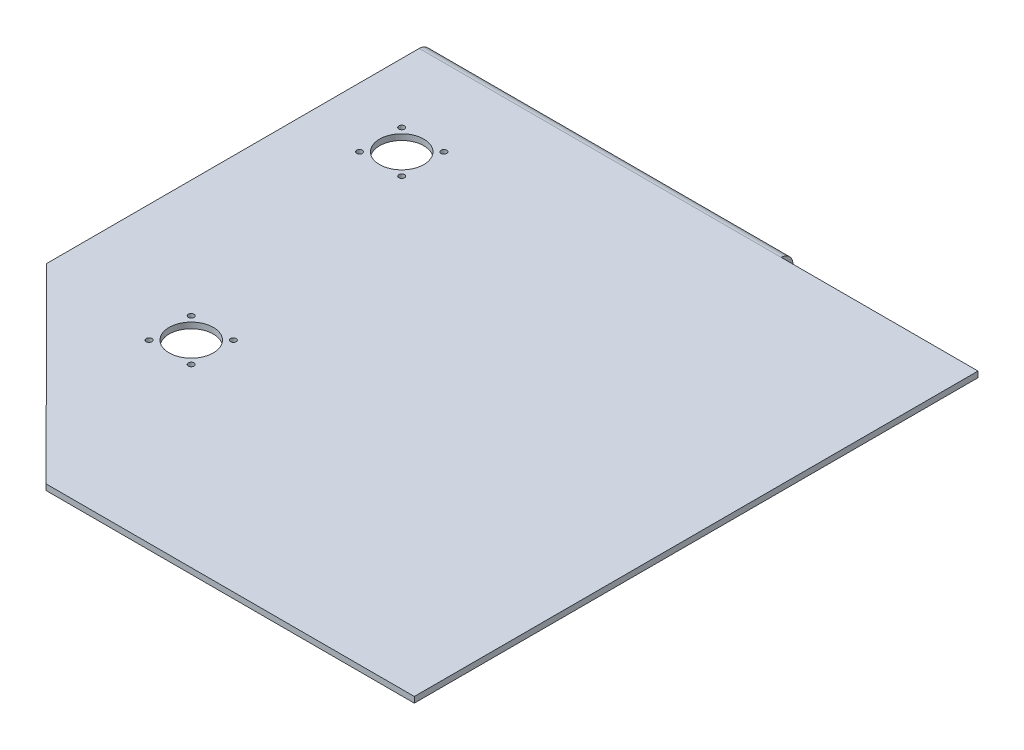
ISO-10303-21;
HEADER;
FILE_DESCRIPTION(('STEP AP214'),'2;1');
FILE_NAME('part.step','',(''),(''),'','','');
FILE_SCHEMA(('AUTOMOTIVE_DESIGN { 1 0 10303 214 1 1 1 1 }'));
ENDSEC;
DATA;
#1=APPLICATION_CONTEXT('core data for automotive mechanical design processes');
#2=APPLICATION_PROTOCOL_DEFINITION('international standard','automotive_design',2000,#1);
#3=PRODUCT_CONTEXT('',#1,'mechanical');
#4=PRODUCT('Part','Part','',(#3));
#5=PRODUCT_RELATED_PRODUCT_CATEGORY('part','',(#4));
#6=PRODUCT_DEFINITION_FORMATION('','',#4);
#7=PRODUCT_DEFINITION_CONTEXT('part definition',#1,'design');
#8=PRODUCT_DEFINITION('design','',#6,#7);
#9=PRODUCT_DEFINITION_SHAPE('','',#8);
#10=(LENGTH_UNIT() NAMED_UNIT(*) SI_UNIT(.MILLI.,.METRE.));
#11=(NAMED_UNIT(*) PLANE_ANGLE_UNIT() SI_UNIT($,.RADIAN.));
#12=(NAMED_UNIT(*) SI_UNIT($,.STERADIAN.) SOLID_ANGLE_UNIT());
#13=UNCERTAINTY_MEASURE_WITH_UNIT(LENGTH_MEASURE(1.E-05),#10,'distance_accuracy_value','');
#14=(GEOMETRIC_REPRESENTATION_CONTEXT(3) GLOBAL_UNCERTAINTY_ASSIGNED_CONTEXT((#13)) GLOBAL_UNIT_ASSIGNED_CONTEXT((#10,
#11,#12)) REPRESENTATION_CONTEXT('',''));
#15=CARTESIAN_POINT('',(0.,0.,0.));
#16=DIRECTION('',(0.,0.,1.));
#17=DIRECTION('',(1.,0.,0.));
#18=AXIS2_PLACEMENT_3D('',#15,#16,#17);
#19=CARTESIAN_POINT('',(50.8,-3.175,-290.95699999996));
#20=DIRECTION('',(0.,0.,-1.));
#21=DIRECTION('',(-1.,0.,0.));
#22=AXIS2_PLACEMENT_3D('',#19,#20,#21);
#23=PLANE('',#22);
#24=DIRECTION('',(-1.,0.,0.));
#25=VECTOR('',#24,1.);
#26=CARTESIAN_POINT('',(50.8,-3.175,-290.95699999996));
#27=LINE('',#26,#25);
#28=CARTESIAN_POINT('',(355.6,-3.175,-290.95699999996));
#29=VERTEX_POINT('',#28);
#30=CARTESIAN_POINT('',(248.312880055998,-3.17500000000001,-290.95699999996));
#31=VERTEX_POINT('',#30);
#32=EDGE_CURVE('E256',#29,#31,#27,.T.);
#33=ORIENTED_EDGE('',*,*,#32,.T.);
#34=DIRECTION('',(0.,1.,0.));
#35=VECTOR('',#34,1.);
#36=CARTESIAN_POINT('',(248.312880055998,-3.17500000000001,-290.95699999996));
#37=LINE('',#36,#35);
#38=CARTESIAN_POINT('',(248.312880055998,0.,-290.95699999996));
#39=VERTEX_POINT('',#38);
#40=EDGE_CURVE('E245',#31,#39,#37,.T.);
#41=ORIENTED_EDGE('',*,*,#40,.T.);
#42=DIRECTION('',(-1.,0.,0.));
#43=VECTOR('',#42,1.);
#44=CARTESIAN_POINT('',(50.8,0.,-290.95699999996));
#45=LINE('',#44,#43);
#46=CARTESIAN_POINT('',(355.6,0.,-290.95699999996));
#47=VERTEX_POINT('',#46);
#48=EDGE_CURVE('E269',#47,#39,#45,.T.);
#49=ORIENTED_EDGE('',*,*,#48,.F.);
#50=DIRECTION('',(0.,1.,0.));
#51=VECTOR('',#50,1.);
#52=CARTESIAN_POINT('',(355.6,-3.175,-290.95699999996));
#53=LINE('',#52,#51);
#54=EDGE_CURVE('E110',#29,#47,#53,.T.);
#55=ORIENTED_EDGE('',*,*,#54,.F.);
#56=EDGE_LOOP('',(#33,#41,#49,#55));
#57=FACE_BOUND('',#56,.T.);
#58=ADVANCED_FACE('F106',(#57),#23,.T.);
#59=CARTESIAN_POINT('',(355.6,-3.175,16.5100000000389));
#60=DIRECTION('',(1.,0.,0.));
#61=DIRECTION('',(0.,0.,-1.));
#62=AXIS2_PLACEMENT_3D('',#59,#60,#61);
#63=PLANE('',#62);
#64=DIRECTION('',(0.,0.,-1.));
#65=VECTOR('',#64,1.);
#66=CARTESIAN_POINT('',(355.6,0.,16.5100000000389));
#67=LINE('',#66,#65);
#68=CARTESIAN_POINT('',(355.6,0.,16.5100000000389));
#69=VERTEX_POINT('',#68);
#70=EDGE_CURVE('E253',#69,#47,#67,.T.);
#71=ORIENTED_EDGE('',*,*,#70,.F.);
#72=DIRECTION('',(0.,1.,0.));
#73=VECTOR('',#72,1.);
#74=CARTESIAN_POINT('',(355.6,-3.175,16.5100000000389));
#75=LINE('',#74,#73);
#76=CARTESIAN_POINT('',(355.6,-3.175,16.5100000000389));
#77=VERTEX_POINT('',#76);
#78=EDGE_CURVE('E13',#77,#69,#75,.T.);
#79=ORIENTED_EDGE('',*,*,#78,.F.);
#80=DIRECTION('',(0.,0.,-1.));
#81=VECTOR('',#80,1.);
#82=CARTESIAN_POINT('',(355.6,-3.175,16.5100000000389));
#83=LINE('',#82,#81);
#84=EDGE_CURVE('E254',#77,#29,#83,.T.);
#85=ORIENTED_EDGE('',*,*,#84,.T.);
#86=ORIENTED_EDGE('',*,*,#54,.T.);
#87=EDGE_LOOP('',(#71,#79,#85,#86));
#88=FACE_BOUND('',#87,.T.);
#89=ADVANCED_FACE('F108',(#88),#63,.T.);
#90=CARTESIAN_POINT('',(154.686,-3.175,16.5100000000389));
#91=DIRECTION('',(0.,0.,1.));
#92=DIRECTION('',(1.,0.,0.));
#93=AXIS2_PLACEMENT_3D('',#90,#91,#92);
#94=PLANE('',#93);
#95=DIRECTION('',(1.,0.,0.));
#96=VECTOR('',#95,1.);
#97=CARTESIAN_POINT('',(154.686,0.,16.5100000000389));
#98=LINE('',#97,#96);
#99=CARTESIAN_POINT('',(154.686,0.,16.5100000000389));
#100=VERTEX_POINT('',#99);
#101=EDGE_CURVE('E257',#100,#69,#98,.T.);
#102=ORIENTED_EDGE('',*,*,#101,.F.);
#103=DIRECTION('',(0.,1.,0.));
#104=VECTOR('',#103,1.);
#105=CARTESIAN_POINT('',(154.686,-3.175,16.5100000000389));
#106=LINE('',#105,#104);
#107=CARTESIAN_POINT('',(154.686,-3.175,16.5100000000389));
#108=VERTEX_POINT('',#107);
#109=EDGE_CURVE('E115',#108,#100,#106,.T.);
#110=ORIENTED_EDGE('',*,*,#109,.F.);
#111=DIRECTION('',(1.,0.,0.));
#112=VECTOR('',#111,1.);
#113=CARTESIAN_POINT('',(154.686,-3.175,16.5100000000389));
#114=LINE('',#113,#112);
#115=EDGE_CURVE('E265',#108,#77,#114,.T.);
#116=ORIENTED_EDGE('',*,*,#115,.T.);
#117=ORIENTED_EDGE('',*,*,#78,.T.);
#118=EDGE_LOOP('',(#102,#110,#116,#117));
#119=FACE_BOUND('',#118,.T.);
#120=ADVANCED_FACE('F289',(#119),#94,.T.);
#121=CARTESIAN_POINT('',(50.8,-3.175,-87.7569999999603));
#122=DIRECTION('',(-0.708399871716806,0.,0.705811321637457));
#123=DIRECTION('',(0.705811321637457,0.,0.708399871716806));
#124=AXIS2_PLACEMENT_3D('',#121,#122,#123);
#125=PLANE('',#124);
#126=DIRECTION('',(0.705811321637457,0.,0.708399871716806));
#127=VECTOR('',#126,1.);
#128=CARTESIAN_POINT('',(50.8,0.,-87.7569999999603));
#129=LINE('',#128,#127);
#130=CARTESIAN_POINT('',(50.8,0.,-87.7569999999603));
#131=VERTEX_POINT('',#130);
#132=EDGE_CURVE('E275',#131,#100,#129,.T.);
#133=ORIENTED_EDGE('',*,*,#132,.F.);
#134=DIRECTION('',(0.,1.,0.));
#135=VECTOR('',#134,1.);
#136=CARTESIAN_POINT('',(50.8,-3.175,-87.7569999999603));
#137=LINE('',#136,#135);
#138=CARTESIAN_POINT('',(50.8,-3.175,-87.7569999999603));
#139=VERTEX_POINT('',#138);
#140=EDGE_CURVE('E281',#139,#131,#137,.T.);
#141=ORIENTED_EDGE('',*,*,#140,.F.);
#142=DIRECTION('',(0.705811321637457,0.,0.708399871716806));
#143=VECTOR('',#142,1.);
#144=CARTESIAN_POINT('',(50.8,-3.175,-87.7569999999603));
#145=LINE('',#144,#143);
#146=EDGE_CURVE('E262',#139,#108,#145,.T.);
#147=ORIENTED_EDGE('',*,*,#146,.T.);
#148=ORIENTED_EDGE('',*,*,#109,.T.);
#149=EDGE_LOOP('',(#133,#141,#147,#148));
#150=FACE_BOUND('',#149,.T.);
#151=ADVANCED_FACE('F293',(#150),#125,.T.);
#152=CARTESIAN_POINT('',(50.8,-3.175,-87.7569999999603));
#153=DIRECTION('',(-1.,0.,0.));
#154=DIRECTION('',(0.,0.,1.));
#155=AXIS2_PLACEMENT_3D('',#152,#153,#154);
#156=PLANE('',#155);
#157=DIRECTION('',(0.,0.,1.));
#158=VECTOR('',#157,1.);
#159=CARTESIAN_POINT('',(50.8,0.,-87.7569999999603));
#160=LINE('',#159,#158);
#161=CARTESIAN_POINT('',(50.7999999999999,0.,-290.95699999996));
#162=VERTEX_POINT('',#161);
#163=EDGE_CURVE('E272',#162,#131,#160,.T.);
#164=ORIENTED_EDGE('',*,*,#163,.F.);
#165=DIRECTION('',(0.,1.,0.));
#166=VECTOR('',#165,1.);
#167=CARTESIAN_POINT('',(50.8,-3.175,-290.95699999996));
#168=LINE('',#167,#166);
#169=CARTESIAN_POINT('',(50.7999999999999,-3.17500000000001,-290.95699999996));
#170=VERTEX_POINT('',#169);
#171=EDGE_CURVE('E282',#170,#162,#168,.T.);
#172=ORIENTED_EDGE('',*,*,#171,.F.);
#173=DIRECTION('',(0.,0.,1.));
#174=VECTOR('',#173,1.);
#175=CARTESIAN_POINT('',(50.8,-3.175,-87.7569999999603));
#176=LINE('',#175,#174);
#177=EDGE_CURVE('E259',#170,#139,#176,.T.);
#178=ORIENTED_EDGE('',*,*,#177,.T.);
#179=ORIENTED_EDGE('',*,*,#140,.T.);
#180=EDGE_LOOP('',(#164,#172,#178,#179));
#181=FACE_BOUND('',#180,.T.);
#182=ADVANCED_FACE('F304',(#181),#156,.T.);
#183=CARTESIAN_POINT('',(0.,-3.175,0.));
#184=DIRECTION('',(0.,-1.,0.));
#185=DIRECTION('',(0.,0.,-1.));
#186=AXIS2_PLACEMENT_3D('',#183,#184,#185);
#187=PLANE('',#186);
#188=CARTESIAN_POINT('',(83.3749999999975,-3.175,-248.833155378787));
#189=DIRECTION('',(0.,1.,0.));
#190=DIRECTION('',(0.,0.,1.));
#191=AXIS2_PLACEMENT_3D('',#188,#189,#190);
#192=CIRCLE('',#191,1.55);
#193=CARTESIAN_POINT('',(83.3749999999975,-3.175,-247.283155378787));
#194=VERTEX_POINT('',#193);
#195=EDGE_CURVE('E413',#194,#194,#192,.T.);
#196=ORIENTED_EDGE('',*,*,#195,.T.);
#197=EDGE_LOOP('',(#196));
#198=FACE_BOUND('',#197,.T.);
#199=CARTESIAN_POINT('',(94.8749999999976,-3.175,-237.333155378788));
#200=DIRECTION('',(0.,1.,0.));
#201=DIRECTION('',(0.,0.,1.));
#202=AXIS2_PLACEMENT_3D('',#199,#200,#201);
#203=CIRCLE('',#202,12.065);
#204=CARTESIAN_POINT('',(94.8749999999976,-3.175,-225.268155378788));
#205=VERTEX_POINT('',#204);
#206=EDGE_CURVE('E405',#205,#205,#203,.T.);
#207=ORIENTED_EDGE('',*,*,#206,.T.);
#208=EDGE_LOOP('',(#207));
#209=FACE_BOUND('',#208,.T.);
#210=CARTESIAN_POINT('',(106.374999999996,-3.175,-248.833155378787));
#211=DIRECTION('',(0.,1.,0.));
#212=DIRECTION('',(0.,0.,1.));
#213=AXIS2_PLACEMENT_3D('',#210,#211,#212);
#214=CIRCLE('',#213,1.55);
#215=CARTESIAN_POINT('',(106.374999999996,-3.175,-247.283155378787));
#216=VERTEX_POINT('',#215);
#217=EDGE_CURVE('E426',#216,#216,#214,.T.);
#218=ORIENTED_EDGE('',*,*,#217,.T.);
#219=EDGE_LOOP('',(#218));
#220=FACE_BOUND('',#219,.T.);
#221=CARTESIAN_POINT('',(106.374999999996,-3.175,-225.833155378788));
#222=DIRECTION('',(0.,1.,0.));
#223=DIRECTION('',(0.,0.,1.));
#224=AXIS2_PLACEMENT_3D('',#221,#222,#223);
#225=CIRCLE('',#224,1.55);
#226=CARTESIAN_POINT('',(106.374999999996,-3.175,-224.283155378788));
#227=VERTEX_POINT('',#226);
#228=EDGE_CURVE('E419',#227,#227,#225,.T.);
#229=ORIENTED_EDGE('',*,*,#228,.T.);
#230=EDGE_LOOP('',(#229));
#231=FACE_BOUND('',#230,.T.);
#232=CARTESIAN_POINT('',(126.41996,-3.175,-90.9661553787875));
#233=DIRECTION('',(0.,1.,0.));
#234=DIRECTION('',(0.,0.,1.));
#235=AXIS2_PLACEMENT_3D('',#232,#233,#234);
#236=CIRCLE('',#235,12.065);
#237=CARTESIAN_POINT('',(126.41996,-3.175,-78.9011553787875));
#238=VERTEX_POINT('',#237);
#239=EDGE_CURVE('E437',#238,#238,#236,.T.);
#240=ORIENTED_EDGE('',*,*,#239,.T.);
#241=EDGE_LOOP('',(#240));
#242=FACE_BOUND('',#241,.T.);
#243=CARTESIAN_POINT('',(114.91996,-3.175,-102.466155378787));
#244=DIRECTION('',(0.,1.,0.));
#245=DIRECTION('',(0.,0.,1.));
#246=AXIS2_PLACEMENT_3D('',#243,#244,#245);
#247=CIRCLE('',#246,1.55);
#248=CARTESIAN_POINT('',(114.91996,-3.175,-100.916155378787));
#249=VERTEX_POINT('',#248);
#250=EDGE_CURVE('E431',#249,#249,#247,.T.);
#251=ORIENTED_EDGE('',*,*,#250,.T.);
#252=EDGE_LOOP('',(#251));
#253=FACE_BOUND('',#252,.T.);
#254=CARTESIAN_POINT('',(137.919959999998,-3.175,-102.466155378787));
#255=DIRECTION('',(0.,1.,0.));
#256=DIRECTION('',(0.,0.,1.));
#257=AXIS2_PLACEMENT_3D('',#254,#255,#256);
#258=CIRCLE('',#257,1.55000000000001);
#259=CARTESIAN_POINT('',(137.919959999998,-3.175,-100.916155378787));
#260=VERTEX_POINT('',#259);
#261=EDGE_CURVE('E448',#260,#260,#258,.T.);
#262=ORIENTED_EDGE('',*,*,#261,.T.);
#263=EDGE_LOOP('',(#262));
#264=FACE_BOUND('',#263,.T.);
#265=CARTESIAN_POINT('',(137.919959999998,-3.175,-79.4661553787875));
#266=DIRECTION('',(0.,1.,0.));
#267=DIRECTION('',(0.,0.,1.));
#268=AXIS2_PLACEMENT_3D('',#265,#266,#267);
#269=CIRCLE('',#268,1.55000000000001);
#270=CARTESIAN_POINT('',(137.919959999998,-3.175,-77.9161553787876));
#271=VERTEX_POINT('',#270);
#272=EDGE_CURVE('E412',#271,#271,#269,.T.);
#273=ORIENTED_EDGE('',*,*,#272,.T.);
#274=EDGE_LOOP('',(#273));
#275=FACE_BOUND('',#274,.T.);
#276=CARTESIAN_POINT('',(114.91996,-3.175,-79.4661553787875));
#277=DIRECTION('',(0.,1.,0.));
#278=DIRECTION('',(0.,0.,1.));
#279=AXIS2_PLACEMENT_3D('',#276,#277,#278);
#280=CIRCLE('',#279,1.55);
#281=CARTESIAN_POINT('',(114.91996,-3.175,-77.9161553787876));
#282=VERTEX_POINT('',#281);
#283=EDGE_CURVE('E396',#282,#282,#280,.T.);
#284=ORIENTED_EDGE('',*,*,#283,.T.);
#285=EDGE_LOOP('',(#284));
#286=FACE_BOUND('',#285,.T.);
#287=CARTESIAN_POINT('',(83.3749999999975,-3.175,-225.833155378788));
#288=DIRECTION('',(0.,1.,0.));
#289=DIRECTION('',(0.,0.,1.));
#290=AXIS2_PLACEMENT_3D('',#287,#288,#289);
#291=CIRCLE('',#290,1.55);
#292=CARTESIAN_POINT('',(83.3749999999975,-3.175,-224.283155378788));
#293=VERTEX_POINT('',#292);
#294=EDGE_CURVE('E242',#293,#293,#291,.T.);
#295=ORIENTED_EDGE('',*,*,#294,.T.);
#296=EDGE_LOOP('',(#295));
#297=FACE_BOUND('',#296,.T.);
#298=ORIENTED_EDGE('',*,*,#84,.F.);
#299=ORIENTED_EDGE('',*,*,#115,.F.);
#300=ORIENTED_EDGE('',*,*,#146,.F.);
#301=ORIENTED_EDGE('',*,*,#177,.F.);
#302=DIRECTION('',(1.,0.,0.));
#303=VECTOR('',#302,1.);
#304=CARTESIAN_POINT('',(248.312880055998,-3.17500000000001,-290.95699999996));
#305=LINE('',#304,#303);
#306=EDGE_CURVE('E249',#31,#170,#305,.F.);
#307=ORIENTED_EDGE('',*,*,#306,.F.);
#308=ORIENTED_EDGE('',*,*,#32,.F.);
#309=EDGE_LOOP('',(#298,#299,#300,#301,#307,#308));
#310=FACE_BOUND('',#309,.T.);
#311=ADVANCED_FACE('F296',(#198,#209,#220,#231,#242,#253,#264,#275,#286,#297,#310),#187,.T.);
#312=CARTESIAN_POINT('',(0.,0.,0.));
#313=DIRECTION('',(0.,-1.,0.));
#314=DIRECTION('',(0.,0.,-1.));
#315=AXIS2_PLACEMENT_3D('',#312,#313,#314);
#316=PLANE('',#315);
#317=CARTESIAN_POINT('',(83.3749999999975,0.,-248.833155378787));
#318=DIRECTION('',(0.,1.,0.));
#319=DIRECTION('',(0.,0.,1.));
#320=AXIS2_PLACEMENT_3D('',#317,#318,#319);
#321=CIRCLE('',#320,1.55);
#322=CARTESIAN_POINT('',(83.3749999999975,0.,-247.283155378787));
#323=VERTEX_POINT('',#322);
#324=EDGE_CURVE('E408',#323,#323,#321,.T.);
#325=ORIENTED_EDGE('',*,*,#324,.F.);
#326=EDGE_LOOP('',(#325));
#327=FACE_BOUND('',#326,.T.);
#328=CARTESIAN_POINT('',(94.8749999999976,0.,-237.333155378788));
#329=DIRECTION('',(0.,1.,0.));
#330=DIRECTION('',(0.,0.,1.));
#331=AXIS2_PLACEMENT_3D('',#328,#329,#330);
#332=CIRCLE('',#331,12.065);
#333=CARTESIAN_POINT('',(94.8749999999976,0.,-225.268155378788));
#334=VERTEX_POINT('',#333);
#335=EDGE_CURVE('E409',#334,#334,#332,.T.);
#336=ORIENTED_EDGE('',*,*,#335,.F.);
#337=EDGE_LOOP('',(#336));
#338=FACE_BOUND('',#337,.T.);
#339=CARTESIAN_POINT('',(106.374999999996,0.,-248.833155378787));
#340=DIRECTION('',(0.,1.,0.));
#341=DIRECTION('',(0.,0.,1.));
#342=AXIS2_PLACEMENT_3D('',#339,#340,#341);
#343=CIRCLE('',#342,1.55);
#344=CARTESIAN_POINT('',(106.374999999996,0.,-247.283155378787));
#345=VERTEX_POINT('',#344);
#346=EDGE_CURVE('E416',#345,#345,#343,.T.);
#347=ORIENTED_EDGE('',*,*,#346,.F.);
#348=EDGE_LOOP('',(#347));
#349=FACE_BOUND('',#348,.T.);
#350=CARTESIAN_POINT('',(106.374999999996,0.,-225.833155378788));
#351=DIRECTION('',(0.,1.,0.));
#352=DIRECTION('',(0.,0.,1.));
#353=AXIS2_PLACEMENT_3D('',#350,#351,#352);
#354=CIRCLE('',#353,1.55);
#355=CARTESIAN_POINT('',(106.374999999996,0.,-224.283155378788));
#356=VERTEX_POINT('',#355);
#357=EDGE_CURVE('E423',#356,#356,#354,.T.);
#358=ORIENTED_EDGE('',*,*,#357,.F.);
#359=EDGE_LOOP('',(#358));
#360=FACE_BOUND('',#359,.T.);
#361=CARTESIAN_POINT('',(126.41996,0.,-90.9661553787875));
#362=DIRECTION('',(0.,1.,0.));
#363=DIRECTION('',(0.,0.,1.));
#364=AXIS2_PLACEMENT_3D('',#361,#362,#363);
#365=CIRCLE('',#364,12.065);
#366=CARTESIAN_POINT('',(126.41996,0.,-78.9011553787875));
#367=VERTEX_POINT('',#366);
#368=EDGE_CURVE('E434',#367,#367,#365,.T.);
#369=ORIENTED_EDGE('',*,*,#368,.F.);
#370=EDGE_LOOP('',(#369));
#371=FACE_BOUND('',#370,.T.);
#372=CARTESIAN_POINT('',(114.91996,0.,-102.466155378787));
#373=DIRECTION('',(0.,1.,0.));
#374=DIRECTION('',(0.,0.,1.));
#375=AXIS2_PLACEMENT_3D('',#372,#373,#374);
#376=CIRCLE('',#375,1.55);
#377=CARTESIAN_POINT('',(114.91996,0.,-100.916155378787));
#378=VERTEX_POINT('',#377);
#379=EDGE_CURVE('E402',#378,#378,#376,.T.);
#380=ORIENTED_EDGE('',*,*,#379,.F.);
#381=EDGE_LOOP('',(#380));
#382=FACE_BOUND('',#381,.T.);
#383=CARTESIAN_POINT('',(137.919959999998,0.,-102.466155378787));
#384=DIRECTION('',(0.,1.,0.));
#385=DIRECTION('',(0.,0.,1.));
#386=AXIS2_PLACEMENT_3D('',#383,#384,#385);
#387=CIRCLE('',#386,1.55000000000001);
#388=CARTESIAN_POINT('',(137.919959999998,0.,-100.916155378787));
#389=VERTEX_POINT('',#388);
#390=EDGE_CURVE('E440',#389,#389,#387,.T.);
#391=ORIENTED_EDGE('',*,*,#390,.F.);
#392=EDGE_LOOP('',(#391));
#393=FACE_BOUND('',#392,.T.);
#394=CARTESIAN_POINT('',(137.919959999998,0.,-79.4661553787875));
#395=DIRECTION('',(0.,1.,0.));
#396=DIRECTION('',(0.,0.,1.));
#397=AXIS2_PLACEMENT_3D('',#394,#395,#396);
#398=CIRCLE('',#397,1.55000000000001);
#399=CARTESIAN_POINT('',(137.919959999998,0.,-77.9161553787876));
#400=VERTEX_POINT('',#399);
#401=EDGE_CURVE('E445',#400,#400,#398,.T.);
#402=ORIENTED_EDGE('',*,*,#401,.F.);
#403=EDGE_LOOP('',(#402));
#404=FACE_BOUND('',#403,.T.);
#405=CARTESIAN_POINT('',(114.91996,0.,-79.4661553787875));
#406=DIRECTION('',(0.,1.,0.));
#407=DIRECTION('',(0.,0.,1.));
#408=AXIS2_PLACEMENT_3D('',#405,#406,#407);
#409=CIRCLE('',#408,1.55);
#410=CARTESIAN_POINT('',(114.91996,0.,-77.9161553787876));
#411=VERTEX_POINT('',#410);
#412=EDGE_CURVE('E399',#411,#411,#409,.T.);
#413=ORIENTED_EDGE('',*,*,#412,.F.);
#414=EDGE_LOOP('',(#413));
#415=FACE_BOUND('',#414,.T.);
#416=CARTESIAN_POINT('',(83.3749999999975,0.,-225.833155378788));
#417=DIRECTION('',(0.,1.,0.));
#418=DIRECTION('',(0.,0.,1.));
#419=AXIS2_PLACEMENT_3D('',#416,#417,#418);
#420=CIRCLE('',#419,1.55);
#421=CARTESIAN_POINT('',(83.3749999999975,0.,-224.283155378788));
#422=VERTEX_POINT('',#421);
#423=EDGE_CURVE('E422',#422,#422,#420,.T.);
#424=ORIENTED_EDGE('',*,*,#423,.F.);
#425=EDGE_LOOP('',(#424));
#426=FACE_BOUND('',#425,.T.);
#427=ORIENTED_EDGE('',*,*,#70,.T.);
#428=ORIENTED_EDGE('',*,*,#48,.T.);
#429=DIRECTION('',(1.,0.,0.));
#430=VECTOR('',#429,1.);
#431=CARTESIAN_POINT('',(248.312880055998,0.,-290.95699999996));
#432=LINE('',#431,#430);
#433=EDGE_CURVE('E195',#39,#162,#432,.F.);
#434=ORIENTED_EDGE('',*,*,#433,.T.);
#435=ORIENTED_EDGE('',*,*,#163,.T.);
#436=ORIENTED_EDGE('',*,*,#132,.T.);
#437=ORIENTED_EDGE('',*,*,#101,.T.);
#438=EDGE_LOOP('',(#427,#428,#434,#435,#436,#437));
#439=FACE_BOUND('',#438,.T.);
#440=ADVANCED_FACE('F287',(#327,#338,#349,#360,#371,#382,#393,#404,#415,#426,#439),#316,.F.);
#441=CARTESIAN_POINT('',(50.7999999999999,-6.34999999999999,-290.95699999996));
#442=DIRECTION('',(-1.,0.,0.));
#443=DIRECTION('',(0.,0.,1.));
#444=AXIS2_PLACEMENT_3D('',#441,#442,#443);
#445=PLANE('',#444);
#446=DIRECTION('',(0.,0.,-1.));
#447=VECTOR('',#446,1.);
#448=CARTESIAN_POINT('',(50.7999999999999,-6.34999999999995,-297.30699999996));
#449=LINE('',#448,#447);
#450=CARTESIAN_POINT('',(50.7999999999999,-6.34999999999998,-294.13199999996));
#451=VERTEX_POINT('',#450);
#452=CARTESIAN_POINT('',(50.7999999999999,-6.34999999999997,-297.30699999996));
#453=VERTEX_POINT('',#452);
#454=EDGE_CURVE('E239',#451,#453,#449,.T.);
#455=ORIENTED_EDGE('',*,*,#454,.F.);
#456=CARTESIAN_POINT('',(50.7999999999999,-6.34999999999999,-290.95699999996));
#457=DIRECTION('',(1.,0.,0.));
#458=DIRECTION('',(0.,0.,-1.));
#459=AXIS2_PLACEMENT_3D('',#456,#457,#458);
#460=CIRCLE('',#459,3.17499999999998);
#461=EDGE_CURVE('E197',#170,#451,#460,.F.);
#462=ORIENTED_EDGE('',*,*,#461,.F.);
#463=ORIENTED_EDGE('',*,*,#171,.T.);
#464=CARTESIAN_POINT('',(50.7999999999999,-6.34999999999999,-290.95699999996));
#465=DIRECTION('',(1.,0.,0.));
#466=DIRECTION('',(0.,0.,-1.));
#467=AXIS2_PLACEMENT_3D('',#464,#465,#466);
#468=CIRCLE('',#467,6.34999999999998);
#469=EDGE_CURVE('E244',#162,#453,#468,.F.);
#470=ORIENTED_EDGE('',*,*,#469,.T.);
#471=EDGE_LOOP('',(#455,#462,#463,#470));
#472=FACE_BOUND('',#471,.T.);
#473=ADVANCED_FACE('F301',(#472),#445,.T.);
#474=CARTESIAN_POINT('',(248.312880055998,-6.34999999999999,-290.95699999996));
#475=DIRECTION('',(-1.,0.,0.));
#476=DIRECTION('',(0.,0.,1.));
#477=AXIS2_PLACEMENT_3D('',#474,#475,#476);
#478=PLANE('',#477);
#479=CARTESIAN_POINT('',(248.312880055998,-6.34999999999999,-290.95699999996));
#480=DIRECTION('',(1.,0.,0.));
#481=DIRECTION('',(0.,0.,-1.));
#482=AXIS2_PLACEMENT_3D('',#479,#480,#481);
#483=CIRCLE('',#482,3.17499999999998);
#484=CARTESIAN_POINT('',(248.312880055998,-6.34999999999998,-294.13199999996));
#485=VERTEX_POINT('',#484);
#486=EDGE_CURVE('E204',#485,#31,#483,.T.);
#487=ORIENTED_EDGE('',*,*,#486,.F.);
#488=DIRECTION('',(0.,0.,-1.));
#489=VECTOR('',#488,1.);
#490=CARTESIAN_POINT('',(248.312880055998,-6.34999999999997,-294.13199999996));
#491=LINE('',#490,#489);
#492=CARTESIAN_POINT('',(248.312880055998,-6.34999999999994,-297.30699999996));
#493=VERTEX_POINT('',#492);
#494=EDGE_CURVE('E201',#485,#493,#491,.T.);
#495=ORIENTED_EDGE('',*,*,#494,.T.);
#496=CARTESIAN_POINT('',(248.312880055998,-6.34999999999999,-290.95699999996));
#497=DIRECTION('',(1.,0.,0.));
#498=DIRECTION('',(0.,0.,-1.));
#499=AXIS2_PLACEMENT_3D('',#496,#497,#498);
#500=CIRCLE('',#499,6.34999999999998);
#501=EDGE_CURVE('E123',#493,#39,#500,.T.);
#502=ORIENTED_EDGE('',*,*,#501,.T.);
#503=ORIENTED_EDGE('',*,*,#40,.F.);
#504=EDGE_LOOP('',(#487,#495,#502,#503));
#505=FACE_BOUND('',#504,.T.);
#506=ADVANCED_FACE('F202',(#505),#478,.F.);
#507=CARTESIAN_POINT('',(248.312880055998,-6.34999999999999,-290.95699999996));
#508=DIRECTION('',(1.,0.,0.));
#509=DIRECTION('',(0.,0.,-1.));
#510=AXIS2_PLACEMENT_3D('',#507,#508,#509);
#511=CYLINDRICAL_SURFACE('',#510,6.34999999999998);
#512=ORIENTED_EDGE('',*,*,#433,.F.);
#513=ORIENTED_EDGE('',*,*,#501,.F.);
#514=DIRECTION('',(1.,0.,0.));
#515=VECTOR('',#514,1.);
#516=CARTESIAN_POINT('',(0.,-6.34999999999994,-297.30699999996));
#517=LINE('',#516,#515);
#518=EDGE_CURVE('E192',#453,#493,#517,.T.);
#519=ORIENTED_EDGE('',*,*,#518,.F.);
#520=ORIENTED_EDGE('',*,*,#469,.F.);
#521=EDGE_LOOP('',(#512,#513,#519,#520));
#522=FACE_BOUND('',#521,.T.);
#523=ADVANCED_FACE('F189',(#522),#511,.T.);
#524=CARTESIAN_POINT('',(248.312880055998,-6.34999999999999,-290.95699999996));
#525=DIRECTION('',(1.,0.,0.));
#526=DIRECTION('',(0.,0.,-1.));
#527=AXIS2_PLACEMENT_3D('',#524,#525,#526);
#528=CYLINDRICAL_SURFACE('',#527,3.17499999999998);
#529=ORIENTED_EDGE('',*,*,#306,.T.);
#530=ORIENTED_EDGE('',*,*,#461,.T.);
#531=DIRECTION('',(-1.,0.,0.));
#532=VECTOR('',#531,1.);
#533=CARTESIAN_POINT('',(50.7999999999999,-6.34999999999997,-294.13199999996));
#534=LINE('',#533,#532);
#535=EDGE_CURVE('E209',#451,#485,#534,.F.);
#536=ORIENTED_EDGE('',*,*,#535,.T.);
#537=ORIENTED_EDGE('',*,*,#486,.T.);
#538=EDGE_LOOP('',(#529,#530,#536,#537));
#539=FACE_BOUND('',#538,.T.);
#540=ADVANCED_FACE('F299',(#539),#528,.F.);
#541=CARTESIAN_POINT('',(248.312880055998,-3.17499999999998,-297.30699999996));
#542=DIRECTION('',(1.,0.,0.));
#543=DIRECTION('',(0.,0.,-1.));
#544=AXIS2_PLACEMENT_3D('',#541,#542,#543);
#545=PLANE('',#544);
#546=DIRECTION('',(0.,1.,0.));
#547=VECTOR('',#546,1.);
#548=CARTESIAN_POINT('',(248.312880055998,-3.17499999999998,-297.30699999996));
#549=LINE('',#548,#547);
#550=CARTESIAN_POINT('',(248.312880055998,-38.1,-297.30699999996));
#551=VERTEX_POINT('',#550);
#552=EDGE_CURVE('E216',#551,#493,#549,.T.);
#553=ORIENTED_EDGE('',*,*,#552,.T.);
#554=ORIENTED_EDGE('',*,*,#494,.F.);
#555=DIRECTION('',(0.,-1.,0.));
#556=VECTOR('',#555,1.);
#557=CARTESIAN_POINT('',(248.312880055998,9.24916708878504E-13,-294.13199999996));
#558=LINE('',#557,#556);
#559=CARTESIAN_POINT('',(248.312880055998,-38.1,-294.13199999996));
#560=VERTEX_POINT('',#559);
#561=EDGE_CURVE('E232',#560,#485,#558,.F.);
#562=ORIENTED_EDGE('',*,*,#561,.F.);
#563=DIRECTION('',(0.,0.,1.));
#564=VECTOR('',#563,1.);
#565=CARTESIAN_POINT('',(248.312880055998,-38.1,-297.30699999996));
#566=LINE('',#565,#564);
#567=EDGE_CURVE('E221',#551,#560,#566,.T.);
#568=ORIENTED_EDGE('',*,*,#567,.F.);
#569=EDGE_LOOP('',(#553,#554,#562,#568));
#570=FACE_BOUND('',#569,.T.);
#571=ADVANCED_FACE('F220',(#570),#545,.T.);
#572=CARTESIAN_POINT('',(50.7999999999999,-38.1,-297.30699999996));
#573=DIRECTION('',(-1.,0.,0.));
#574=DIRECTION('',(0.,0.,1.));
#575=AXIS2_PLACEMENT_3D('',#572,#573,#574);
#576=PLANE('',#575);
#577=DIRECTION('',(0.,1.,0.));
#578=VECTOR('',#577,1.);
#579=CARTESIAN_POINT('',(50.7999999999999,9.24916708878504E-13,-294.13199999996));
#580=LINE('',#579,#578);
#581=CARTESIAN_POINT('',(50.7999999999999,-38.1,-294.13199999996));
#582=VERTEX_POINT('',#581);
#583=EDGE_CURVE('E218',#451,#582,#580,.F.);
#584=ORIENTED_EDGE('',*,*,#583,.F.);
#585=ORIENTED_EDGE('',*,*,#454,.T.);
#586=DIRECTION('',(0.,-1.,0.));
#587=VECTOR('',#586,1.);
#588=CARTESIAN_POINT('',(50.7999999999999,-38.1,-297.30699999996));
#589=LINE('',#588,#587);
#590=CARTESIAN_POINT('',(50.7999999999999,-38.1,-297.30699999996));
#591=VERTEX_POINT('',#590);
#592=EDGE_CURVE('E217',#453,#591,#589,.T.);
#593=ORIENTED_EDGE('',*,*,#592,.T.);
#594=DIRECTION('',(0.,0.,1.));
#595=VECTOR('',#594,1.);
#596=CARTESIAN_POINT('',(50.7999999999999,-38.1,-297.30699999996));
#597=LINE('',#596,#595);
#598=EDGE_CURVE('E223',#591,#582,#597,.T.);
#599=ORIENTED_EDGE('',*,*,#598,.T.);
#600=EDGE_LOOP('',(#584,#585,#593,#599));
#601=FACE_BOUND('',#600,.T.);
#602=ADVANCED_FACE('F336',(#601),#576,.T.);
#603=CARTESIAN_POINT('',(0.,9.36002162129331E-13,-297.30699999996));
#604=DIRECTION('',(0.,0.,-1.));
#605=DIRECTION('',(0.,1.,0.));
#606=AXIS2_PLACEMENT_3D('',#603,#604,#605);
#607=PLANE('',#606);
#608=ORIENTED_EDGE('',*,*,#592,.F.);
#609=ORIENTED_EDGE('',*,*,#518,.T.);
#610=ORIENTED_EDGE('',*,*,#552,.F.);
#611=DIRECTION('',(1.,0.,0.));
#612=VECTOR('',#611,1.);
#613=CARTESIAN_POINT('',(248.312880055998,-38.1,-297.30699999996));
#614=LINE('',#613,#612);
#615=EDGE_CURVE('E224',#591,#551,#614,.T.);
#616=ORIENTED_EDGE('',*,*,#615,.F.);
#617=EDGE_LOOP('',(#608,#609,#610,#616));
#618=FACE_BOUND('',#617,.T.);
#619=ADVANCED_FACE('F214',(#618),#607,.T.);
#620=CARTESIAN_POINT('',(0.,9.24916708878504E-13,-294.13199999996));
#621=DIRECTION('',(0.,0.,-1.));
#622=DIRECTION('',(0.,1.,0.));
#623=AXIS2_PLACEMENT_3D('',#620,#621,#622);
#624=PLANE('',#623);
#625=ORIENTED_EDGE('',*,*,#535,.F.);
#626=ORIENTED_EDGE('',*,*,#583,.T.);
#627=DIRECTION('',(-1.,0.,0.));
#628=VECTOR('',#627,1.);
#629=CARTESIAN_POINT('',(0.,-38.1,-294.13199999996));
#630=LINE('',#629,#628);
#631=EDGE_CURVE('E234',#582,#560,#630,.F.);
#632=ORIENTED_EDGE('',*,*,#631,.T.);
#633=ORIENTED_EDGE('',*,*,#561,.T.);
#634=EDGE_LOOP('',(#625,#626,#632,#633));
#635=FACE_BOUND('',#634,.T.);
#636=ADVANCED_FACE('F344',(#635),#624,.F.);
#637=CARTESIAN_POINT('',(248.312880055998,-38.1,-297.30699999996));
#638=DIRECTION('',(0.,-1.,0.));
#639=DIRECTION('',(0.,0.,-1.));
#640=AXIS2_PLACEMENT_3D('',#637,#638,#639);
#641=PLANE('',#640);
#642=ORIENTED_EDGE('',*,*,#631,.F.);
#643=ORIENTED_EDGE('',*,*,#598,.F.);
#644=ORIENTED_EDGE('',*,*,#615,.T.);
#645=ORIENTED_EDGE('',*,*,#567,.T.);
#646=EDGE_LOOP('',(#642,#643,#644,#645));
#647=FACE_BOUND('',#646,.T.);
#648=ADVANCED_FACE('F340',(#647),#641,.T.);
#649=CARTESIAN_POINT('',(83.3749999999975,-3.175,-225.833155378788));
#650=DIRECTION('',(0.,1.,0.));
#651=DIRECTION('',(0.,0.,1.));
#652=AXIS2_PLACEMENT_3D('',#649,#650,#651);
#653=CYLINDRICAL_SURFACE('',#652,1.55);
#654=ORIENTED_EDGE('',*,*,#294,.F.);
#655=EDGE_LOOP('',(#654));
#656=FACE_BOUND('',#655,.T.);
#657=ORIENTED_EDGE('',*,*,#423,.T.);
#658=EDGE_LOOP('',(#657));
#659=FACE_BOUND('',#658,.T.);
#660=ADVANCED_FACE('F343',(#656,#659),#653,.F.);
#661=CARTESIAN_POINT('',(114.91996,-3.175,-79.4661553787875));
#662=DIRECTION('',(0.,1.,0.));
#663=DIRECTION('',(0.,0.,1.));
#664=AXIS2_PLACEMENT_3D('',#661,#662,#663);
#665=CYLINDRICAL_SURFACE('',#664,1.55);
#666=ORIENTED_EDGE('',*,*,#283,.F.);
#667=EDGE_LOOP('',(#666));
#668=FACE_BOUND('',#667,.T.);
#669=ORIENTED_EDGE('',*,*,#412,.T.);
#670=EDGE_LOOP('',(#669));
#671=FACE_BOUND('',#670,.T.);
#672=ADVANCED_FACE('F355',(#668,#671),#665,.F.);
#673=CARTESIAN_POINT('',(137.919959999998,-3.175,-79.4661553787875));
#674=DIRECTION('',(0.,1.,0.));
#675=DIRECTION('',(0.,0.,1.));
#676=AXIS2_PLACEMENT_3D('',#673,#674,#675);
#677=CYLINDRICAL_SURFACE('',#676,1.55000000000001);
#678=ORIENTED_EDGE('',*,*,#272,.F.);
#679=EDGE_LOOP('',(#678));
#680=FACE_BOUND('',#679,.T.);
#681=ORIENTED_EDGE('',*,*,#401,.T.);
#682=EDGE_LOOP('',(#681));
#683=FACE_BOUND('',#682,.T.);
#684=ADVANCED_FACE('F361',(#680,#683),#677,.F.);
#685=CARTESIAN_POINT('',(137.919959999998,-3.175,-102.466155378787));
#686=DIRECTION('',(0.,1.,0.));
#687=DIRECTION('',(0.,0.,1.));
#688=AXIS2_PLACEMENT_3D('',#685,#686,#687);
#689=CYLINDRICAL_SURFACE('',#688,1.55000000000001);
#690=ORIENTED_EDGE('',*,*,#261,.F.);
#691=EDGE_LOOP('',(#690));
#692=FACE_BOUND('',#691,.T.);
#693=ORIENTED_EDGE('',*,*,#390,.T.);
#694=EDGE_LOOP('',(#693));
#695=FACE_BOUND('',#694,.T.);
#696=ADVANCED_FACE('F357',(#692,#695),#689,.F.);
#697=CARTESIAN_POINT('',(114.91996,-3.175,-102.466155378787));
#698=DIRECTION('',(0.,1.,0.));
#699=DIRECTION('',(0.,0.,1.));
#700=AXIS2_PLACEMENT_3D('',#697,#698,#699);
#701=CYLINDRICAL_SURFACE('',#700,1.55);
#702=ORIENTED_EDGE('',*,*,#250,.F.);
#703=EDGE_LOOP('',(#702));
#704=FACE_BOUND('',#703,.T.);
#705=ORIENTED_EDGE('',*,*,#379,.T.);
#706=EDGE_LOOP('',(#705));
#707=FACE_BOUND('',#706,.T.);
#708=ADVANCED_FACE('F360',(#704,#707),#701,.F.);
#709=CARTESIAN_POINT('',(126.41996,-3.175,-90.9661553787875));
#710=DIRECTION('',(0.,1.,0.));
#711=DIRECTION('',(0.,0.,1.));
#712=AXIS2_PLACEMENT_3D('',#709,#710,#711);
#713=CYLINDRICAL_SURFACE('',#712,12.065);
#714=ORIENTED_EDGE('',*,*,#239,.F.);
#715=EDGE_LOOP('',(#714));
#716=FACE_BOUND('',#715,.T.);
#717=ORIENTED_EDGE('',*,*,#368,.T.);
#718=EDGE_LOOP('',(#717));
#719=FACE_BOUND('',#718,.T.);
#720=ADVANCED_FACE('F366',(#716,#719),#713,.F.);
#721=CARTESIAN_POINT('',(106.374999999996,-3.175,-225.833155378788));
#722=DIRECTION('',(0.,1.,0.));
#723=DIRECTION('',(0.,0.,1.));
#724=AXIS2_PLACEMENT_3D('',#721,#722,#723);
#725=CYLINDRICAL_SURFACE('',#724,1.55);
#726=ORIENTED_EDGE('',*,*,#228,.F.);
#727=EDGE_LOOP('',(#726));
#728=FACE_BOUND('',#727,.T.);
#729=ORIENTED_EDGE('',*,*,#357,.T.);
#730=EDGE_LOOP('',(#729));
#731=FACE_BOUND('',#730,.T.);
#732=ADVANCED_FACE('F369',(#728,#731),#725,.F.);
#733=CARTESIAN_POINT('',(106.374999999996,-3.175,-248.833155378787));
#734=DIRECTION('',(0.,1.,0.));
#735=DIRECTION('',(0.,0.,1.));
#736=AXIS2_PLACEMENT_3D('',#733,#734,#735);
#737=CYLINDRICAL_SURFACE('',#736,1.55);
#738=ORIENTED_EDGE('',*,*,#217,.F.);
#739=EDGE_LOOP('',(#738));
#740=FACE_BOUND('',#739,.T.);
#741=ORIENTED_EDGE('',*,*,#346,.T.);
#742=EDGE_LOOP('',(#741));
#743=FACE_BOUND('',#742,.T.);
#744=ADVANCED_FACE('F374',(#740,#743),#737,.F.);
#745=CARTESIAN_POINT('',(94.8749999999976,-3.175,-237.333155378788));
#746=DIRECTION('',(0.,1.,0.));
#747=DIRECTION('',(0.,0.,1.));
#748=AXIS2_PLACEMENT_3D('',#745,#746,#747);
#749=CYLINDRICAL_SURFACE('',#748,12.065);
#750=ORIENTED_EDGE('',*,*,#206,.F.);
#751=EDGE_LOOP('',(#750));
#752=FACE_BOUND('',#751,.T.);
#753=ORIENTED_EDGE('',*,*,#335,.T.);
#754=EDGE_LOOP('',(#753));
#755=FACE_BOUND('',#754,.T.);
#756=ADVANCED_FACE('F377',(#752,#755),#749,.F.);
#757=CARTESIAN_POINT('',(83.3749999999975,-3.175,-248.833155378787));
#758=DIRECTION('',(0.,1.,0.));
#759=DIRECTION('',(0.,0.,1.));
#760=AXIS2_PLACEMENT_3D('',#757,#758,#759);
#761=CYLINDRICAL_SURFACE('',#760,1.55);
#762=ORIENTED_EDGE('',*,*,#195,.F.);
#763=EDGE_LOOP('',(#762));
#764=FACE_BOUND('',#763,.T.);
#765=ORIENTED_EDGE('',*,*,#324,.T.);
#766=EDGE_LOOP('',(#765));
#767=FACE_BOUND('',#766,.T.);
#768=ADVANCED_FACE('F382',(#764,#767),#761,.F.);
#769=CLOSED_SHELL('',(#58,#89,#120,#151,#182,#311,#440,#473,#506,#523,#540,#571,#602,#619,#636,
#648,#660,#672,#684,#696,#708,#720,#732,#744,#756,#768));
#770=MANIFOLD_SOLID_BREP('B2',#769);
#771=ADVANCED_BREP_SHAPE_REPRESENTATION('',(#18,#770),#14);
#772=SHAPE_DEFINITION_REPRESENTATION(#9,#771);
ENDSEC;
END-ISO-10303-21;
